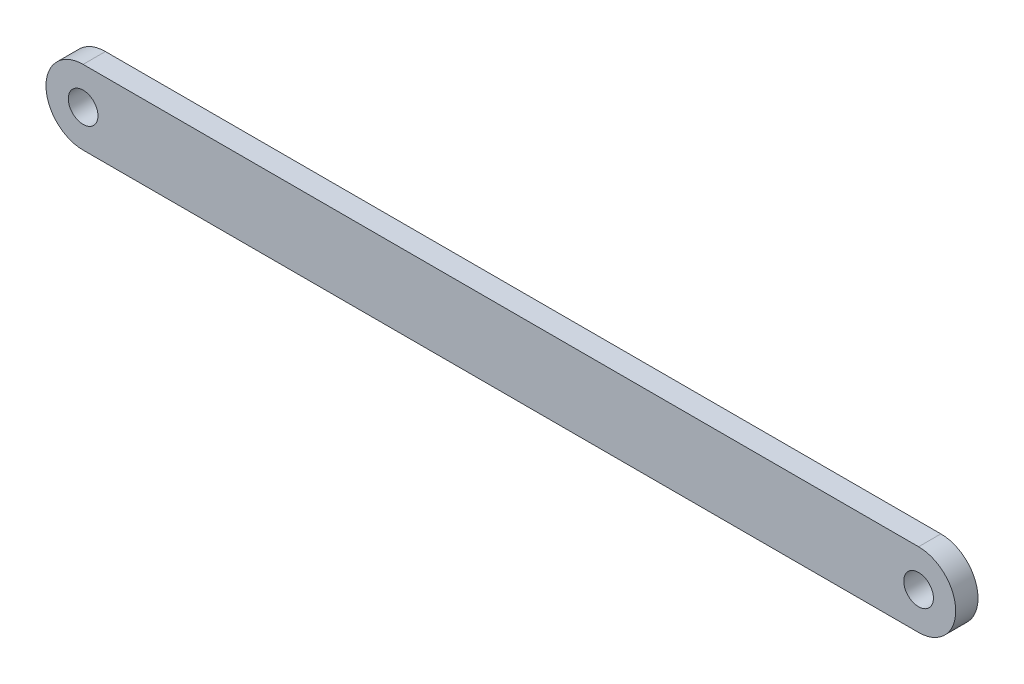
ISO-10303-21;
HEADER;
FILE_DESCRIPTION(('STEP AP214'),'2;1');
FILE_NAME('part.step','',(''),(''),'','','');
FILE_SCHEMA(('AUTOMOTIVE_DESIGN { 1 0 10303 214 1 1 1 1 }'));
ENDSEC;
DATA;
#1=APPLICATION_CONTEXT('core data for automotive mechanical design processes');
#2=APPLICATION_PROTOCOL_DEFINITION('international standard','automotive_design',2000,#1);
#3=PRODUCT_CONTEXT('',#1,'mechanical');
#4=PRODUCT('Part','Part','',(#3));
#5=PRODUCT_RELATED_PRODUCT_CATEGORY('part','',(#4));
#6=PRODUCT_DEFINITION_FORMATION('','',#4);
#7=PRODUCT_DEFINITION_CONTEXT('part definition',#1,'design');
#8=PRODUCT_DEFINITION('design','',#6,#7);
#9=PRODUCT_DEFINITION_SHAPE('','',#8);
#10=(LENGTH_UNIT() NAMED_UNIT(*) SI_UNIT(.MILLI.,.METRE.));
#11=(NAMED_UNIT(*) PLANE_ANGLE_UNIT() SI_UNIT($,.RADIAN.));
#12=(NAMED_UNIT(*) SI_UNIT($,.STERADIAN.) SOLID_ANGLE_UNIT());
#13=UNCERTAINTY_MEASURE_WITH_UNIT(LENGTH_MEASURE(1.E-05),#10,'distance_accuracy_value','');
#14=(GEOMETRIC_REPRESENTATION_CONTEXT(3) GLOBAL_UNCERTAINTY_ASSIGNED_CONTEXT((#13)) GLOBAL_UNIT_ASSIGNED_CONTEXT((#10,
#11,#12)) REPRESENTATION_CONTEXT('',''));
#15=CARTESIAN_POINT('',(0.,0.,0.));
#16=DIRECTION('',(0.,0.,1.));
#17=DIRECTION('',(1.,0.,0.));
#18=AXIS2_PLACEMENT_3D('',#15,#16,#17);
#19=CARTESIAN_POINT('',(0.,0.,1.5));
#20=DIRECTION('',(0.,0.,1.));
#21=DIRECTION('',(1.,0.,0.));
#22=AXIS2_PLACEMENT_3D('',#19,#20,#21);
#23=PLANE('',#22);
#24=CARTESIAN_POINT('',(112.5,0.,1.5));
#25=DIRECTION('',(0.,0.,1.));
#26=DIRECTION('',(1.,0.,0.));
#27=AXIS2_PLACEMENT_3D('',#24,#25,#26);
#28=CIRCLE('',#27,2.);
#29=CARTESIAN_POINT('',(114.5,0.,1.5));
#30=VERTEX_POINT('',#29);
#31=EDGE_CURVE('E101',#30,#30,#28,.T.);
#32=ORIENTED_EDGE('',*,*,#31,.F.);
#33=EDGE_LOOP('',(#32));
#34=FACE_BOUND('',#33,.T.);
#35=CARTESIAN_POINT('',(0.,0.,1.5));
#36=DIRECTION('',(0.,0.,1.));
#37=DIRECTION('',(1.,0.,0.));
#38=AXIS2_PLACEMENT_3D('',#35,#36,#37);
#39=CIRCLE('',#38,5.);
#40=CARTESIAN_POINT('',(0.,5.,1.5));
#41=VERTEX_POINT('',#40);
#42=CARTESIAN_POINT('',(0.,-5.,1.5));
#43=VERTEX_POINT('',#42);
#44=EDGE_CURVE('E86',#41,#43,#39,.T.);
#45=ORIENTED_EDGE('',*,*,#44,.T.);
#46=DIRECTION('',(1.,0.,0.));
#47=VECTOR('',#46,1.);
#48=CARTESIAN_POINT('',(0.,-5.,1.5));
#49=LINE('',#48,#47);
#50=CARTESIAN_POINT('',(112.5,-5.,1.5));
#51=VERTEX_POINT('',#50);
#52=EDGE_CURVE('E81',#43,#51,#49,.T.);
#53=ORIENTED_EDGE('',*,*,#52,.T.);
#54=CARTESIAN_POINT('',(112.5,0.,1.5));
#55=DIRECTION('',(0.,0.,1.));
#56=DIRECTION('',(1.,0.,0.));
#57=AXIS2_PLACEMENT_3D('',#54,#55,#56);
#58=CIRCLE('',#57,5.);
#59=CARTESIAN_POINT('',(112.5,5.,1.5));
#60=VERTEX_POINT('',#59);
#61=EDGE_CURVE('E84',#51,#60,#58,.T.);
#62=ORIENTED_EDGE('',*,*,#61,.T.);
#63=DIRECTION('',(-1.,0.,0.));
#64=VECTOR('',#63,1.);
#65=CARTESIAN_POINT('',(0.,5.,1.5));
#66=LINE('',#65,#64);
#67=EDGE_CURVE('E51',#60,#41,#66,.T.);
#68=ORIENTED_EDGE('',*,*,#67,.T.);
#69=EDGE_LOOP('',(#45,#53,#62,#68));
#70=FACE_BOUND('',#69,.T.);
#71=CARTESIAN_POINT('',(0.,0.,1.5));
#72=DIRECTION('',(0.,0.,1.));
#73=DIRECTION('',(1.,0.,0.));
#74=AXIS2_PLACEMENT_3D('',#71,#72,#73);
#75=CIRCLE('',#74,2.);
#76=CARTESIAN_POINT('',(2.00000000000001,0.,1.5));
#77=VERTEX_POINT('',#76);
#78=EDGE_CURVE('E116',#77,#77,#75,.T.);
#79=ORIENTED_EDGE('',*,*,#78,.F.);
#80=EDGE_LOOP('',(#79));
#81=FACE_BOUND('',#80,.T.);
#82=ADVANCED_FACE('F34',(#34,#70,#81),#23,.T.);
#83=CARTESIAN_POINT('',(0.,0.,-1.5));
#84=DIRECTION('',(0.,0.,1.));
#85=DIRECTION('',(1.,0.,0.));
#86=AXIS2_PLACEMENT_3D('',#83,#84,#85);
#87=PLANE('',#86);
#88=CARTESIAN_POINT('',(0.,0.,-1.5));
#89=DIRECTION('',(0.,0.,1.));
#90=DIRECTION('',(1.,0.,0.));
#91=AXIS2_PLACEMENT_3D('',#88,#89,#90);
#92=CIRCLE('',#91,5.);
#93=CARTESIAN_POINT('',(0.,5.,-1.5));
#94=VERTEX_POINT('',#93);
#95=CARTESIAN_POINT('',(0.,-5.,-1.5));
#96=VERTEX_POINT('',#95);
#97=EDGE_CURVE('E98',#94,#96,#92,.T.);
#98=ORIENTED_EDGE('',*,*,#97,.F.);
#99=DIRECTION('',(-1.,0.,0.));
#100=VECTOR('',#99,1.);
#101=CARTESIAN_POINT('',(0.,5.,-1.5));
#102=LINE('',#101,#100);
#103=CARTESIAN_POINT('',(112.5,5.,-1.5));
#104=VERTEX_POINT('',#103);
#105=EDGE_CURVE('E74',#104,#94,#102,.T.);
#106=ORIENTED_EDGE('',*,*,#105,.F.);
#107=CARTESIAN_POINT('',(112.5,0.,-1.5));
#108=DIRECTION('',(0.,0.,1.));
#109=DIRECTION('',(1.,0.,0.));
#110=AXIS2_PLACEMENT_3D('',#107,#108,#109);
#111=CIRCLE('',#110,5.);
#112=CARTESIAN_POINT('',(112.5,-5.,-1.5));
#113=VERTEX_POINT('',#112);
#114=EDGE_CURVE('E68',#113,#104,#111,.T.);
#115=ORIENTED_EDGE('',*,*,#114,.F.);
#116=DIRECTION('',(1.,0.,0.));
#117=VECTOR('',#116,1.);
#118=CARTESIAN_POINT('',(0.,-5.,-1.5));
#119=LINE('',#118,#117);
#120=EDGE_CURVE('E90',#96,#113,#119,.T.);
#121=ORIENTED_EDGE('',*,*,#120,.F.);
#122=EDGE_LOOP('',(#98,#106,#115,#121));
#123=FACE_BOUND('',#122,.T.);
#124=CARTESIAN_POINT('',(112.5,0.,-1.5));
#125=DIRECTION('',(0.,0.,1.));
#126=DIRECTION('',(1.,0.,0.));
#127=AXIS2_PLACEMENT_3D('',#124,#125,#126);
#128=CIRCLE('',#127,2.);
#129=CARTESIAN_POINT('',(114.5,0.,-1.5));
#130=VERTEX_POINT('',#129);
#131=EDGE_CURVE('E113',#130,#130,#128,.T.);
#132=ORIENTED_EDGE('',*,*,#131,.T.);
#133=EDGE_LOOP('',(#132));
#134=FACE_BOUND('',#133,.T.);
#135=CARTESIAN_POINT('',(0.,0.,-1.5));
#136=DIRECTION('',(0.,0.,1.));
#137=DIRECTION('',(1.,0.,0.));
#138=AXIS2_PLACEMENT_3D('',#135,#136,#137);
#139=CIRCLE('',#138,2.);
#140=CARTESIAN_POINT('',(2.00000000000001,0.,-1.5));
#141=VERTEX_POINT('',#140);
#142=EDGE_CURVE('E119',#141,#141,#139,.T.);
#143=ORIENTED_EDGE('',*,*,#142,.T.);
#144=EDGE_LOOP('',(#143));
#145=FACE_BOUND('',#144,.T.);
#146=ADVANCED_FACE('F109',(#123,#134,#145),#87,.F.);
#147=CARTESIAN_POINT('',(0.,0.,1.5));
#148=DIRECTION('',(0.,0.,-1.));
#149=DIRECTION('',(-1.,0.,0.));
#150=AXIS2_PLACEMENT_3D('',#147,#148,#149);
#151=CYLINDRICAL_SURFACE('',#150,5.);
#152=ORIENTED_EDGE('',*,*,#97,.T.);
#153=DIRECTION('',(0.,0.,-1.));
#154=VECTOR('',#153,1.);
#155=CARTESIAN_POINT('',(0.,-5.,1.5));
#156=LINE('',#155,#154);
#157=EDGE_CURVE('E11',#43,#96,#156,.T.);
#158=ORIENTED_EDGE('',*,*,#157,.F.);
#159=ORIENTED_EDGE('',*,*,#44,.F.);
#160=DIRECTION('',(0.,0.,-1.));
#161=VECTOR('',#160,1.);
#162=CARTESIAN_POINT('',(0.,5.,1.5));
#163=LINE('',#162,#161);
#164=EDGE_CURVE('E94',#41,#94,#163,.T.);
#165=ORIENTED_EDGE('',*,*,#164,.T.);
#166=EDGE_LOOP('',(#152,#158,#159,#165));
#167=FACE_BOUND('',#166,.T.);
#168=ADVANCED_FACE('F36',(#167),#151,.T.);
#169=CARTESIAN_POINT('',(0.,-5.,1.5));
#170=DIRECTION('',(0.,1.,0.));
#171=DIRECTION('',(0.,0.,1.));
#172=AXIS2_PLACEMENT_3D('',#169,#170,#171);
#173=PLANE('',#172);
#174=ORIENTED_EDGE('',*,*,#120,.T.);
#175=DIRECTION('',(0.,0.,-1.));
#176=VECTOR('',#175,1.);
#177=CARTESIAN_POINT('',(112.5,-5.,1.5));
#178=LINE('',#177,#176);
#179=EDGE_CURVE('E43',#51,#113,#178,.T.);
#180=ORIENTED_EDGE('',*,*,#179,.F.);
#181=ORIENTED_EDGE('',*,*,#52,.F.);
#182=ORIENTED_EDGE('',*,*,#157,.T.);
#183=EDGE_LOOP('',(#174,#180,#181,#182));
#184=FACE_BOUND('',#183,.T.);
#185=ADVANCED_FACE('F89',(#184),#173,.F.);
#186=CARTESIAN_POINT('',(112.5,0.,1.5));
#187=DIRECTION('',(0.,0.,-1.));
#188=DIRECTION('',(-1.,0.,0.));
#189=AXIS2_PLACEMENT_3D('',#186,#187,#188);
#190=CYLINDRICAL_SURFACE('',#189,5.);
#191=ORIENTED_EDGE('',*,*,#114,.T.);
#192=DIRECTION('',(0.,0.,-1.));
#193=VECTOR('',#192,1.);
#194=CARTESIAN_POINT('',(112.5,5.,1.5));
#195=LINE('',#194,#193);
#196=EDGE_CURVE('E91',#60,#104,#195,.T.);
#197=ORIENTED_EDGE('',*,*,#196,.F.);
#198=ORIENTED_EDGE('',*,*,#61,.F.);
#199=ORIENTED_EDGE('',*,*,#179,.T.);
#200=EDGE_LOOP('',(#191,#197,#198,#199));
#201=FACE_BOUND('',#200,.T.);
#202=ADVANCED_FACE('F92',(#201),#190,.T.);
#203=CARTESIAN_POINT('',(0.,5.,1.5));
#204=DIRECTION('',(0.,-1.,0.));
#205=DIRECTION('',(0.,0.,-1.));
#206=AXIS2_PLACEMENT_3D('',#203,#204,#205);
#207=PLANE('',#206);
#208=ORIENTED_EDGE('',*,*,#105,.T.);
#209=ORIENTED_EDGE('',*,*,#164,.F.);
#210=ORIENTED_EDGE('',*,*,#67,.F.);
#211=ORIENTED_EDGE('',*,*,#196,.T.);
#212=EDGE_LOOP('',(#208,#209,#210,#211));
#213=FACE_BOUND('',#212,.T.);
#214=ADVANCED_FACE('F106',(#213),#207,.F.);
#215=CARTESIAN_POINT('',(112.5,0.,1.5));
#216=DIRECTION('',(0.,0.,-1.));
#217=DIRECTION('',(-1.,0.,0.));
#218=AXIS2_PLACEMENT_3D('',#215,#216,#217);
#219=CYLINDRICAL_SURFACE('',#218,2.);
#220=ORIENTED_EDGE('',*,*,#31,.T.);
#221=EDGE_LOOP('',(#220));
#222=FACE_BOUND('',#221,.T.);
#223=ORIENTED_EDGE('',*,*,#131,.F.);
#224=EDGE_LOOP('',(#223));
#225=FACE_BOUND('',#224,.T.);
#226=ADVANCED_FACE('F136',(#222,#225),#219,.F.);
#227=CARTESIAN_POINT('',(0.,0.,1.5));
#228=DIRECTION('',(0.,0.,-1.));
#229=DIRECTION('',(-1.,0.,0.));
#230=AXIS2_PLACEMENT_3D('',#227,#228,#229);
#231=CYLINDRICAL_SURFACE('',#230,2.);
#232=ORIENTED_EDGE('',*,*,#78,.T.);
#233=EDGE_LOOP('',(#232));
#234=FACE_BOUND('',#233,.T.);
#235=ORIENTED_EDGE('',*,*,#142,.F.);
#236=EDGE_LOOP('',(#235));
#237=FACE_BOUND('',#236,.T.);
#238=ADVANCED_FACE('F125',(#234,#237),#231,.F.);
#239=CLOSED_SHELL('',(#82,#146,#168,#185,#202,#214,#226,#238));
#240=MANIFOLD_SOLID_BREP('B2',#239);
#241=ADVANCED_BREP_SHAPE_REPRESENTATION('',(#18,#240),#14);
#242=SHAPE_DEFINITION_REPRESENTATION(#9,#241);
ENDSEC;
END-ISO-10303-21;
